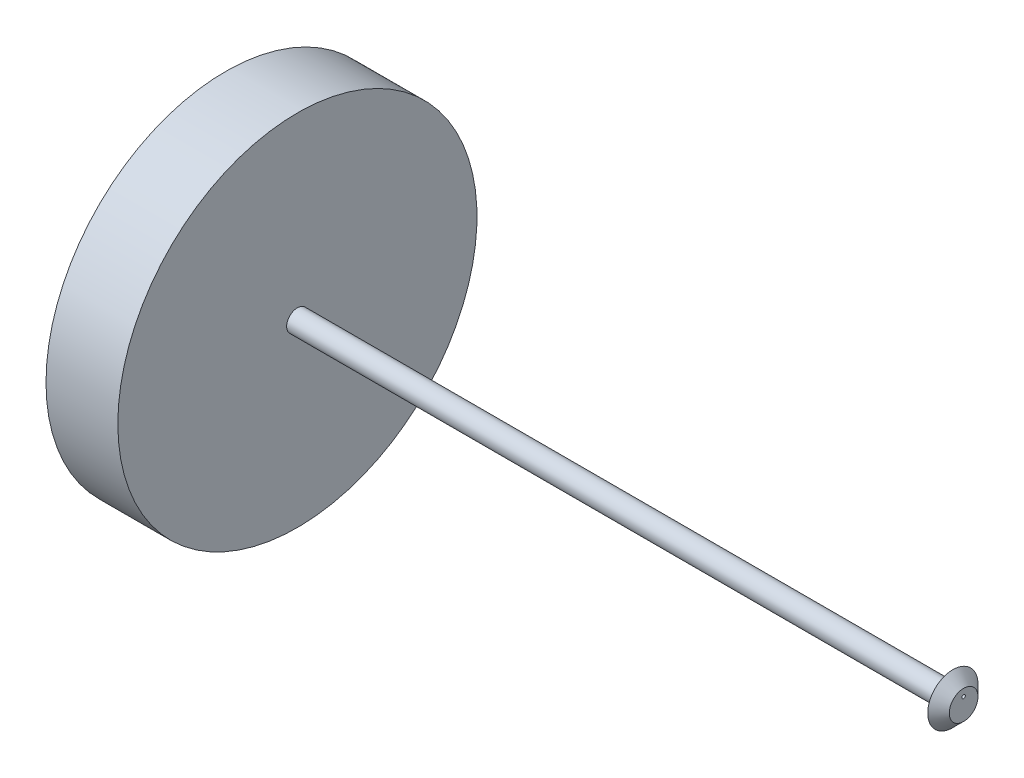
ISO-10303-21;
HEADER;
FILE_DESCRIPTION(('STEP AP214'),'2;1');
FILE_NAME('part.step','',(''),(''),'','','');
FILE_SCHEMA(('AUTOMOTIVE_DESIGN { 1 0 10303 214 1 1 1 1 }'));
ENDSEC;
DATA;
#1=APPLICATION_CONTEXT('core data for automotive mechanical design processes');
#2=APPLICATION_PROTOCOL_DEFINITION('international standard','automotive_design',2000,#1);
#3=PRODUCT_CONTEXT('',#1,'mechanical');
#4=PRODUCT('Part','Part','',(#3));
#5=PRODUCT_RELATED_PRODUCT_CATEGORY('part','',(#4));
#6=PRODUCT_DEFINITION_FORMATION('','',#4);
#7=PRODUCT_DEFINITION_CONTEXT('part definition',#1,'design');
#8=PRODUCT_DEFINITION('design','',#6,#7);
#9=PRODUCT_DEFINITION_SHAPE('','',#8);
#10=(LENGTH_UNIT() NAMED_UNIT(*) SI_UNIT(.MILLI.,.METRE.));
#11=(NAMED_UNIT(*) PLANE_ANGLE_UNIT() SI_UNIT($,.RADIAN.));
#12=(NAMED_UNIT(*) SI_UNIT($,.STERADIAN.) SOLID_ANGLE_UNIT());
#13=UNCERTAINTY_MEASURE_WITH_UNIT(LENGTH_MEASURE(1.E-05),#10,'distance_accuracy_value','');
#14=(GEOMETRIC_REPRESENTATION_CONTEXT(3) GLOBAL_UNCERTAINTY_ASSIGNED_CONTEXT((#13)) GLOBAL_UNIT_ASSIGNED_CONTEXT((#10,
#11,#12)) REPRESENTATION_CONTEXT('',''));
#15=CARTESIAN_POINT('',(0.,0.,0.));
#16=DIRECTION('',(0.,0.,1.));
#17=DIRECTION('',(1.,0.,0.));
#18=AXIS2_PLACEMENT_3D('',#15,#16,#17);
#19=CARTESIAN_POINT('',(-8.75000000000008,0.,-125.));
#20=DIRECTION('',(1.,0.,0.));
#21=DIRECTION('',(0.,0.,-1.));
#22=AXIS2_PLACEMENT_3D('',#19,#20,#21);
#23=PLANE('',#22);
#24=CARTESIAN_POINT('',(-8.75000000000008,0.,-125.));
#25=DIRECTION('',(-1.,0.,0.));
#26=DIRECTION('',(0.,0.,1.));
#27=AXIS2_PLACEMENT_3D('',#24,#25,#26);
#28=CIRCLE('',#27,1.5);
#29=CARTESIAN_POINT('',(-8.75000000000008,0.,-123.5));
#30=VERTEX_POINT('',#29);
#31=EDGE_CURVE('E10',#30,#30,#28,.T.);
#32=ORIENTED_EDGE('',*,*,#31,.F.);
#33=EDGE_LOOP('',(#32));
#34=FACE_BOUND('',#33,.T.);
#35=CARTESIAN_POINT('',(-8.75000000000008,0.,-125.));
#36=DIRECTION('',(1.,0.,0.));
#37=DIRECTION('',(0.,0.,-1.));
#38=AXIS2_PLACEMENT_3D('',#35,#36,#37);
#39=CIRCLE('',#38,3.50000000000003);
#40=CARTESIAN_POINT('',(-8.75000000000008,0.,-128.5));
#41=VERTEX_POINT('',#40);
#42=EDGE_CURVE('E55',#41,#41,#39,.T.);
#43=ORIENTED_EDGE('',*,*,#42,.F.);
#44=EDGE_LOOP('',(#43));
#45=FACE_BOUND('',#44,.T.);
#46=ADVANCED_FACE('F41',(#34,#45),#23,.F.);
#47=CARTESIAN_POINT('',(-100.,0.,-125.));
#48=DIRECTION('',(1.,0.,0.));
#49=DIRECTION('',(0.,0.,-1.));
#50=AXIS2_PLACEMENT_3D('',#47,#48,#49);
#51=CYLINDRICAL_SURFACE('',#50,1.5);
#52=CARTESIAN_POINT('',(-100.,0.,-125.));
#53=DIRECTION('',(-1.,0.,0.));
#54=DIRECTION('',(0.,0.,1.));
#55=AXIS2_PLACEMENT_3D('',#52,#53,#54);
#56=CIRCLE('',#55,1.5);
#57=CARTESIAN_POINT('',(-100.,0.,-123.5));
#58=VERTEX_POINT('',#57);
#59=EDGE_CURVE('E47',#58,#58,#56,.T.);
#60=ORIENTED_EDGE('',*,*,#59,.F.);
#61=EDGE_LOOP('',(#60));
#62=FACE_BOUND('',#61,.T.);
#63=ORIENTED_EDGE('',*,*,#31,.T.);
#64=EDGE_LOOP('',(#63));
#65=FACE_BOUND('',#64,.T.);
#66=ADVANCED_FACE('F90',(#62,#65),#51,.T.);
#67=CARTESIAN_POINT('',(-8.75000000000008,0.,-125.));
#68=DIRECTION('',(-1.,0.,0.));
#69=DIRECTION('',(0.,0.,1.));
#70=AXIS2_PLACEMENT_3D('',#67,#68,#69);
#71=CONICAL_SURFACE('',#70,3.50000000000003,0.78539816339744);
#72=CARTESIAN_POINT('',(-7.25000000000008,0.,-125.));
#73=DIRECTION('',(1.,0.,0.));
#74=DIRECTION('',(0.,0.,-1.));
#75=AXIS2_PLACEMENT_3D('',#72,#73,#74);
#76=CIRCLE('',#75,2.00000000000006);
#77=CARTESIAN_POINT('',(-7.25000000000008,0.,-127.));
#78=VERTEX_POINT('',#77);
#79=EDGE_CURVE('E51',#78,#78,#76,.T.);
#80=ORIENTED_EDGE('',*,*,#79,.F.);
#81=EDGE_LOOP('',(#80));
#82=FACE_BOUND('',#81,.T.);
#83=ORIENTED_EDGE('',*,*,#42,.T.);
#84=EDGE_LOOP('',(#83));
#85=FACE_BOUND('',#84,.T.);
#86=ADVANCED_FACE('F96',(#82,#85),#71,.T.);
#87=CARTESIAN_POINT('',(-7.25000000000008,0.,-125.));
#88=DIRECTION('',(1.,0.,0.));
#89=DIRECTION('',(0.,0.,-1.));
#90=AXIS2_PLACEMENT_3D('',#87,#88,#89);
#91=PLANE('',#90);
#92=CARTESIAN_POINT('',(-7.25000000000008,1.00000000000003,-125.));
#93=DIRECTION('',(1.,0.,0.));
#94=DIRECTION('',(0.,0.,-1.));
#95=AXIS2_PLACEMENT_3D('',#92,#93,#94);
#96=CIRCLE('',#95,0.250000000000013);
#97=CARTESIAN_POINT('',(-7.25000000000008,1.00000000000003,-125.25));
#98=VERTEX_POINT('',#97);
#99=EDGE_CURVE('E61',#98,#98,#96,.T.);
#100=ORIENTED_EDGE('',*,*,#99,.F.);
#101=EDGE_LOOP('',(#100));
#102=FACE_BOUND('',#101,.T.);
#103=ORIENTED_EDGE('',*,*,#79,.T.);
#104=EDGE_LOOP('',(#103));
#105=FACE_BOUND('',#104,.T.);
#106=ADVANCED_FACE('F103',(#102,#105),#91,.T.);
#107=CARTESIAN_POINT('',(-8.25000000000008,1.00000000000003,-125.));
#108=DIRECTION('',(1.,0.,0.));
#109=DIRECTION('',(0.,0.,-1.));
#110=AXIS2_PLACEMENT_3D('',#107,#108,#109);
#111=CYLINDRICAL_SURFACE('',#110,0.250000000000013);
#112=CARTESIAN_POINT('',(-8.25000000000008,1.00000000000003,-125.));
#113=DIRECTION('',(1.,0.,0.));
#114=DIRECTION('',(0.,0.,-1.));
#115=AXIS2_PLACEMENT_3D('',#112,#113,#114);
#116=CIRCLE('',#115,0.250000000000013);
#117=CARTESIAN_POINT('',(-8.25000000000008,1.00000000000003,-125.25));
#118=VERTEX_POINT('',#117);
#119=EDGE_CURVE('E60',#118,#118,#116,.T.);
#120=ORIENTED_EDGE('',*,*,#119,.F.);
#121=EDGE_LOOP('',(#120));
#122=FACE_BOUND('',#121,.T.);
#123=ORIENTED_EDGE('',*,*,#99,.T.);
#124=EDGE_LOOP('',(#123));
#125=FACE_BOUND('',#124,.T.);
#126=ADVANCED_FACE('F110',(#122,#125),#111,.F.);
#127=CARTESIAN_POINT('',(-8.25000000000008,0.,0.));
#128=DIRECTION('',(1.,0.,0.));
#129=DIRECTION('',(0.,0.,-1.));
#130=AXIS2_PLACEMENT_3D('',#127,#128,#129);
#131=PLANE('',#130);
#132=ORIENTED_EDGE('',*,*,#119,.T.);
#133=EDGE_LOOP('',(#132));
#134=FACE_BOUND('',#133,.T.);
#135=ADVANCED_FACE('F78',(#134),#131,.T.);
#136=CARTESIAN_POINT('',(-110.,0.,-125.000000000001));
#137=DIRECTION('',(1.,0.,0.));
#138=DIRECTION('',(0.,0.,-1.));
#139=AXIS2_PLACEMENT_3D('',#136,#137,#138);
#140=CYLINDRICAL_SURFACE('',#139,25.);
#141=CARTESIAN_POINT('',(-110.,0.,-125.000000000001));
#142=DIRECTION('',(-1.,0.,0.));
#143=DIRECTION('',(0.,0.,1.));
#144=AXIS2_PLACEMENT_3D('',#141,#142,#143);
#145=CIRCLE('',#144,25.);
#146=CARTESIAN_POINT('',(-110.,0.,-100.000000000001));
#147=VERTEX_POINT('',#146);
#148=EDGE_CURVE('E64',#147,#147,#145,.T.);
#149=ORIENTED_EDGE('',*,*,#148,.F.);
#150=EDGE_LOOP('',(#149));
#151=FACE_BOUND('',#150,.T.);
#152=CARTESIAN_POINT('',(-100.,0.,-125.000000000001));
#153=DIRECTION('',(-1.,0.,0.));
#154=DIRECTION('',(0.,0.,1.));
#155=AXIS2_PLACEMENT_3D('',#152,#153,#154);
#156=CIRCLE('',#155,25.);
#157=CARTESIAN_POINT('',(-100.,0.,-100.000000000001));
#158=VERTEX_POINT('',#157);
#159=EDGE_CURVE('E67',#158,#158,#156,.T.);
#160=ORIENTED_EDGE('',*,*,#159,.T.);
#161=EDGE_LOOP('',(#160));
#162=FACE_BOUND('',#161,.T.);
#163=ADVANCED_FACE('F75',(#151,#162),#140,.T.);
#164=CARTESIAN_POINT('',(-110.,0.,-125.000000000001));
#165=DIRECTION('',(-1.,0.,0.));
#166=DIRECTION('',(0.,0.,1.));
#167=AXIS2_PLACEMENT_3D('',#164,#165,#166);
#168=PLANE('',#167);
#169=ORIENTED_EDGE('',*,*,#148,.T.);
#170=EDGE_LOOP('',(#169));
#171=FACE_BOUND('',#170,.T.);
#172=ADVANCED_FACE('F73',(#171),#168,.T.);
#173=CARTESIAN_POINT('',(-100.,0.,-125.000000000001));
#174=DIRECTION('',(-1.,0.,0.));
#175=DIRECTION('',(0.,0.,1.));
#176=AXIS2_PLACEMENT_3D('',#173,#174,#175);
#177=PLANE('',#176);
#178=ORIENTED_EDGE('',*,*,#59,.T.);
#179=EDGE_LOOP('',(#178));
#180=FACE_BOUND('',#179,.T.);
#181=ORIENTED_EDGE('',*,*,#159,.F.);
#182=EDGE_LOOP('',(#181));
#183=FACE_BOUND('',#182,.T.);
#184=ADVANCED_FACE('F82',(#180,#183),#177,.F.);
#185=CLOSED_SHELL('',(#46,#66,#86,#106,#126,#135,#163,#172,#184));
#186=MANIFOLD_SOLID_BREP('B2',#185);
#187=ADVANCED_BREP_SHAPE_REPRESENTATION('',(#18,#186),#14);
#188=SHAPE_DEFINITION_REPRESENTATION(#9,#187);
ENDSEC;
END-ISO-10303-21;
